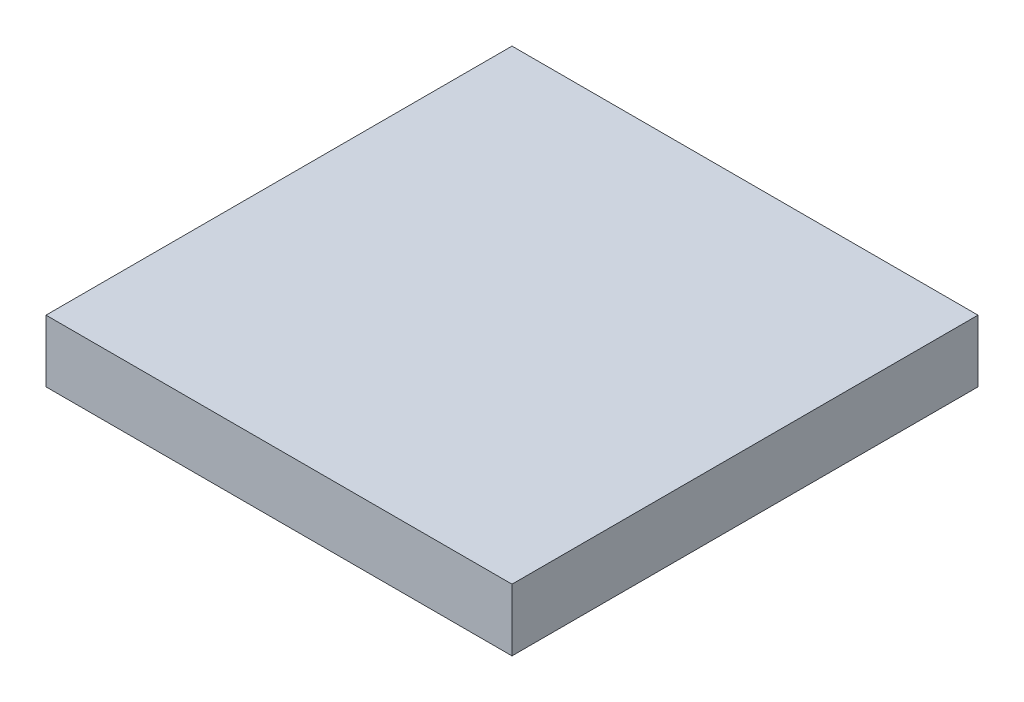
ISO-10303-21;
HEADER;
FILE_DESCRIPTION(('STEP AP214'),'2;1');
FILE_NAME('part.step','',(''),(''),'','','');
FILE_SCHEMA(('AUTOMOTIVE_DESIGN { 1 0 10303 214 1 1 1 1 }'));
ENDSEC;
DATA;
#1=APPLICATION_CONTEXT('core data for automotive mechanical design processes');
#2=APPLICATION_PROTOCOL_DEFINITION('international standard','automotive_design',2000,#1);
#3=PRODUCT_CONTEXT('',#1,'mechanical');
#4=PRODUCT('Part','Part','',(#3));
#5=PRODUCT_RELATED_PRODUCT_CATEGORY('part','',(#4));
#6=PRODUCT_DEFINITION_FORMATION('','',#4);
#7=PRODUCT_DEFINITION_CONTEXT('part definition',#1,'design');
#8=PRODUCT_DEFINITION('design','',#6,#7);
#9=PRODUCT_DEFINITION_SHAPE('','',#8);
#10=(LENGTH_UNIT() NAMED_UNIT(*) SI_UNIT(.MILLI.,.METRE.));
#11=(NAMED_UNIT(*) PLANE_ANGLE_UNIT() SI_UNIT($,.RADIAN.));
#12=(NAMED_UNIT(*) SI_UNIT($,.STERADIAN.) SOLID_ANGLE_UNIT());
#13=UNCERTAINTY_MEASURE_WITH_UNIT(LENGTH_MEASURE(1.E-05),#10,'distance_accuracy_value','');
#14=(GEOMETRIC_REPRESENTATION_CONTEXT(3) GLOBAL_UNCERTAINTY_ASSIGNED_CONTEXT((#13)) GLOBAL_UNIT_ASSIGNED_CONTEXT((#10,
#11,#12)) REPRESENTATION_CONTEXT('',''));
#15=CARTESIAN_POINT('',(0.,0.,0.));
#16=DIRECTION('',(0.,0.,1.));
#17=DIRECTION('',(1.,0.,0.));
#18=AXIS2_PLACEMENT_3D('',#15,#16,#17);
#19=CARTESIAN_POINT('',(-375.,100.,375.));
#20=DIRECTION('',(1.,0.,0.));
#21=DIRECTION('',(0.,0.,-1.));
#22=AXIS2_PLACEMENT_3D('',#19,#20,#21);
#23=PLANE('',#22);
#24=DIRECTION('',(0.,0.,1.));
#25=VECTOR('',#24,1.);
#26=CARTESIAN_POINT('',(-375.,0.,375.));
#27=LINE('',#26,#25);
#28=CARTESIAN_POINT('',(-375.,0.,-375.));
#29=VERTEX_POINT('',#28);
#30=CARTESIAN_POINT('',(-375.,0.,375.));
#31=VERTEX_POINT('',#30);
#32=EDGE_CURVE('E143',#29,#31,#27,.T.);
#33=ORIENTED_EDGE('',*,*,#32,.T.);
#34=DIRECTION('',(0.,-1.,0.));
#35=VECTOR('',#34,1.);
#36=CARTESIAN_POINT('',(-375.,100.,375.));
#37=LINE('',#36,#35);
#38=CARTESIAN_POINT('',(-375.,100.,375.));
#39=VERTEX_POINT('',#38);
#40=EDGE_CURVE('E11',#39,#31,#37,.T.);
#41=ORIENTED_EDGE('',*,*,#40,.F.);
#42=DIRECTION('',(0.,0.,1.));
#43=VECTOR('',#42,1.);
#44=CARTESIAN_POINT('',(-375.,100.,375.));
#45=LINE('',#44,#43);
#46=CARTESIAN_POINT('',(-375.,100.,-375.));
#47=VERTEX_POINT('',#46);
#48=EDGE_CURVE('E147',#47,#39,#45,.T.);
#49=ORIENTED_EDGE('',*,*,#48,.F.);
#50=DIRECTION('',(0.,-1.,0.));
#51=VECTOR('',#50,1.);
#52=CARTESIAN_POINT('',(-375.,100.,-375.));
#53=LINE('',#52,#51);
#54=EDGE_CURVE('E153',#47,#29,#53,.T.);
#55=ORIENTED_EDGE('',*,*,#54,.T.);
#56=EDGE_LOOP('',(#33,#41,#49,#55));
#57=FACE_BOUND('',#56,.T.);
#58=ADVANCED_FACE('F35',(#57),#23,.F.);
#59=CARTESIAN_POINT('',(375.,100.,375.));
#60=DIRECTION('',(0.,0.,-1.));
#61=DIRECTION('',(-1.,0.,0.));
#62=AXIS2_PLACEMENT_3D('',#59,#60,#61);
#63=PLANE('',#62);
#64=DIRECTION('',(1.,0.,0.));
#65=VECTOR('',#64,1.);
#66=CARTESIAN_POINT('',(375.,0.,375.));
#67=LINE('',#66,#65);
#68=CARTESIAN_POINT('',(375.,0.,375.));
#69=VERTEX_POINT('',#68);
#70=EDGE_CURVE('E156',#31,#69,#67,.T.);
#71=ORIENTED_EDGE('',*,*,#70,.T.);
#72=DIRECTION('',(0.,-1.,0.));
#73=VECTOR('',#72,1.);
#74=CARTESIAN_POINT('',(375.,100.,375.));
#75=LINE('',#74,#73);
#76=CARTESIAN_POINT('',(375.,100.,375.));
#77=VERTEX_POINT('',#76);
#78=EDGE_CURVE('E42',#77,#69,#75,.T.);
#79=ORIENTED_EDGE('',*,*,#78,.F.);
#80=DIRECTION('',(1.,0.,0.));
#81=VECTOR('',#80,1.);
#82=CARTESIAN_POINT('',(375.,100.,375.));
#83=LINE('',#82,#81);
#84=EDGE_CURVE('E86',#39,#77,#83,.T.);
#85=ORIENTED_EDGE('',*,*,#84,.F.);
#86=ORIENTED_EDGE('',*,*,#40,.T.);
#87=EDGE_LOOP('',(#71,#79,#85,#86));
#88=FACE_BOUND('',#87,.T.);
#89=ADVANCED_FACE('F184',(#88),#63,.F.);
#90=CARTESIAN_POINT('',(375.,100.,375.));
#91=DIRECTION('',(-1.,0.,0.));
#92=DIRECTION('',(0.,0.,1.));
#93=AXIS2_PLACEMENT_3D('',#90,#91,#92);
#94=PLANE('',#93);
#95=DIRECTION('',(0.,0.,-1.));
#96=VECTOR('',#95,1.);
#97=CARTESIAN_POINT('',(375.,0.,375.));
#98=LINE('',#97,#96);
#99=CARTESIAN_POINT('',(375.,0.,-375.));
#100=VERTEX_POINT('',#99);
#101=EDGE_CURVE('E158',#69,#100,#98,.T.);
#102=ORIENTED_EDGE('',*,*,#101,.T.);
#103=DIRECTION('',(0.,-1.,0.));
#104=VECTOR('',#103,1.);
#105=CARTESIAN_POINT('',(375.,100.,-375.));
#106=LINE('',#105,#104);
#107=CARTESIAN_POINT('',(375.,100.,-375.));
#108=VERTEX_POINT('',#107);
#109=EDGE_CURVE('E162',#108,#100,#106,.T.);
#110=ORIENTED_EDGE('',*,*,#109,.F.);
#111=DIRECTION('',(0.,0.,-1.));
#112=VECTOR('',#111,1.);
#113=CARTESIAN_POINT('',(375.,100.,375.));
#114=LINE('',#113,#112);
#115=EDGE_CURVE('E150',#77,#108,#114,.T.);
#116=ORIENTED_EDGE('',*,*,#115,.F.);
#117=ORIENTED_EDGE('',*,*,#78,.T.);
#118=EDGE_LOOP('',(#102,#110,#116,#117));
#119=FACE_BOUND('',#118,.T.);
#120=ADVANCED_FACE('F167',(#119),#94,.F.);
#121=CARTESIAN_POINT('',(375.,100.,-375.));
#122=DIRECTION('',(0.,0.,1.));
#123=DIRECTION('',(1.,0.,0.));
#124=AXIS2_PLACEMENT_3D('',#121,#122,#123);
#125=PLANE('',#124);
#126=DIRECTION('',(-1.,0.,0.));
#127=VECTOR('',#126,1.);
#128=CARTESIAN_POINT('',(375.,0.,-375.));
#129=LINE('',#128,#127);
#130=EDGE_CURVE('E79',#100,#29,#129,.T.);
#131=ORIENTED_EDGE('',*,*,#130,.T.);
#132=ORIENTED_EDGE('',*,*,#54,.F.);
#133=DIRECTION('',(-1.,0.,0.));
#134=VECTOR('',#133,1.);
#135=CARTESIAN_POINT('',(375.,100.,-375.));
#136=LINE('',#135,#134);
#137=EDGE_CURVE('E58',#108,#47,#136,.T.);
#138=ORIENTED_EDGE('',*,*,#137,.F.);
#139=ORIENTED_EDGE('',*,*,#109,.T.);
#140=EDGE_LOOP('',(#131,#132,#138,#139));
#141=FACE_BOUND('',#140,.T.);
#142=ADVANCED_FACE('F175',(#141),#125,.F.);
#143=CARTESIAN_POINT('',(0.,100.,0.));
#144=DIRECTION('',(0.,1.,0.));
#145=DIRECTION('',(0.,0.,1.));
#146=AXIS2_PLACEMENT_3D('',#143,#144,#145);
#147=PLANE('',#146);
#148=ORIENTED_EDGE('',*,*,#48,.T.);
#149=ORIENTED_EDGE('',*,*,#84,.T.);
#150=ORIENTED_EDGE('',*,*,#115,.T.);
#151=ORIENTED_EDGE('',*,*,#137,.T.);
#152=EDGE_LOOP('',(#148,#149,#150,#151));
#153=FACE_BOUND('',#152,.T.);
#154=ADVANCED_FACE('F177',(#153),#147,.T.);
#155=CARTESIAN_POINT('',(0.,0.,0.));
#156=DIRECTION('',(0.,1.,0.));
#157=DIRECTION('',(0.,0.,1.));
#158=AXIS2_PLACEMENT_3D('',#155,#156,#157);
#159=PLANE('',#158);
#160=DIRECTION('',(1.,0.,0.));
#161=VECTOR('',#160,1.);
#162=CARTESIAN_POINT('',(300.,0.,-300.));
#163=LINE('',#162,#161);
#164=CARTESIAN_POINT('',(-300.,0.,-300.));
#165=VERTEX_POINT('',#164);
#166=CARTESIAN_POINT('',(300.,0.,-300.));
#167=VERTEX_POINT('',#166);
#168=EDGE_CURVE('E137',#165,#167,#163,.T.);
#169=ORIENTED_EDGE('',*,*,#168,.F.);
#170=DIRECTION('',(0.,0.,-1.));
#171=VECTOR('',#170,1.);
#172=CARTESIAN_POINT('',(-300.,0.,-300.));
#173=LINE('',#172,#171);
#174=CARTESIAN_POINT('',(-300.,0.,300.));
#175=VERTEX_POINT('',#174);
#176=EDGE_CURVE('E49',#175,#165,#173,.T.);
#177=ORIENTED_EDGE('',*,*,#176,.F.);
#178=DIRECTION('',(-1.,0.,0.));
#179=VECTOR('',#178,1.);
#180=CARTESIAN_POINT('',(300.,0.,300.));
#181=LINE('',#180,#179);
#182=CARTESIAN_POINT('',(300.,0.,300.));
#183=VERTEX_POINT('',#182);
#184=EDGE_CURVE('E128',#183,#175,#181,.T.);
#185=ORIENTED_EDGE('',*,*,#184,.F.);
#186=DIRECTION('',(0.,0.,1.));
#187=VECTOR('',#186,1.);
#188=CARTESIAN_POINT('',(300.,0.,-300.));
#189=LINE('',#188,#187);
#190=EDGE_CURVE('E131',#167,#183,#189,.T.);
#191=ORIENTED_EDGE('',*,*,#190,.F.);
#192=EDGE_LOOP('',(#169,#177,#185,#191));
#193=FACE_BOUND('',#192,.T.);
#194=ORIENTED_EDGE('',*,*,#32,.F.);
#195=ORIENTED_EDGE('',*,*,#130,.F.);
#196=ORIENTED_EDGE('',*,*,#101,.F.);
#197=ORIENTED_EDGE('',*,*,#70,.F.);
#198=EDGE_LOOP('',(#194,#195,#196,#197));
#199=FACE_BOUND('',#198,.T.);
#200=ADVANCED_FACE('F171',(#193,#199),#159,.F.);
#201=CARTESIAN_POINT('',(-300.,50.,-300.));
#202=DIRECTION('',(-1.,0.,0.));
#203=DIRECTION('',(0.,0.,1.));
#204=AXIS2_PLACEMENT_3D('',#201,#202,#203);
#205=PLANE('',#204);
#206=ORIENTED_EDGE('',*,*,#176,.T.);
#207=DIRECTION('',(0.,-1.,0.));
#208=VECTOR('',#207,1.);
#209=CARTESIAN_POINT('',(-300.,50.,-300.));
#210=LINE('',#209,#208);
#211=CARTESIAN_POINT('',(-300.,50.,-300.));
#212=VERTEX_POINT('',#211);
#213=EDGE_CURVE('E106',#212,#165,#210,.T.);
#214=ORIENTED_EDGE('',*,*,#213,.F.);
#215=DIRECTION('',(0.,0.,-1.));
#216=VECTOR('',#215,1.);
#217=CARTESIAN_POINT('',(-300.,50.,-300.));
#218=LINE('',#217,#216);
#219=CARTESIAN_POINT('',(-300.,50.,300.));
#220=VERTEX_POINT('',#219);
#221=EDGE_CURVE('E110',#220,#212,#218,.T.);
#222=ORIENTED_EDGE('',*,*,#221,.F.);
#223=DIRECTION('',(0.,-1.,0.));
#224=VECTOR('',#223,1.);
#225=CARTESIAN_POINT('',(-300.,50.,300.));
#226=LINE('',#225,#224);
#227=EDGE_CURVE('E141',#220,#175,#226,.T.);
#228=ORIENTED_EDGE('',*,*,#227,.T.);
#229=EDGE_LOOP('',(#206,#214,#222,#228));
#230=FACE_BOUND('',#229,.T.);
#231=ADVANCED_FACE('F108',(#230),#205,.F.);
#232=CARTESIAN_POINT('',(300.,50.,300.));
#233=DIRECTION('',(0.,0.,1.));
#234=DIRECTION('',(1.,0.,0.));
#235=AXIS2_PLACEMENT_3D('',#232,#233,#234);
#236=PLANE('',#235);
#237=ORIENTED_EDGE('',*,*,#184,.T.);
#238=ORIENTED_EDGE('',*,*,#227,.F.);
#239=DIRECTION('',(-1.,0.,0.));
#240=VECTOR('',#239,1.);
#241=CARTESIAN_POINT('',(300.,50.,300.));
#242=LINE('',#241,#240);
#243=CARTESIAN_POINT('',(300.,50.,300.));
#244=VERTEX_POINT('',#243);
#245=EDGE_CURVE('E116',#244,#220,#242,.T.);
#246=ORIENTED_EDGE('',*,*,#245,.F.);
#247=DIRECTION('',(0.,-1.,0.));
#248=VECTOR('',#247,1.);
#249=CARTESIAN_POINT('',(300.,50.,300.));
#250=LINE('',#249,#248);
#251=EDGE_CURVE('E144',#244,#183,#250,.T.);
#252=ORIENTED_EDGE('',*,*,#251,.T.);
#253=EDGE_LOOP('',(#237,#238,#246,#252));
#254=FACE_BOUND('',#253,.T.);
#255=ADVANCED_FACE('F225',(#254),#236,.F.);
#256=CARTESIAN_POINT('',(300.,50.,-300.));
#257=DIRECTION('',(1.,0.,0.));
#258=DIRECTION('',(0.,0.,-1.));
#259=AXIS2_PLACEMENT_3D('',#256,#257,#258);
#260=PLANE('',#259);
#261=ORIENTED_EDGE('',*,*,#190,.T.);
#262=ORIENTED_EDGE('',*,*,#251,.F.);
#263=DIRECTION('',(0.,0.,1.));
#264=VECTOR('',#263,1.);
#265=CARTESIAN_POINT('',(300.,50.,-300.));
#266=LINE('',#265,#264);
#267=CARTESIAN_POINT('',(300.,50.,-300.));
#268=VERTEX_POINT('',#267);
#269=EDGE_CURVE('E124',#268,#244,#266,.T.);
#270=ORIENTED_EDGE('',*,*,#269,.F.);
#271=DIRECTION('',(0.,-1.,0.));
#272=VECTOR('',#271,1.);
#273=CARTESIAN_POINT('',(300.,50.,-300.));
#274=LINE('',#273,#272);
#275=EDGE_CURVE('E115',#268,#167,#274,.T.);
#276=ORIENTED_EDGE('',*,*,#275,.T.);
#277=EDGE_LOOP('',(#261,#262,#270,#276));
#278=FACE_BOUND('',#277,.T.);
#279=ADVANCED_FACE('F234',(#278),#260,.F.);
#280=CARTESIAN_POINT('',(300.,50.,-300.));
#281=DIRECTION('',(0.,0.,-1.));
#282=DIRECTION('',(-1.,0.,0.));
#283=AXIS2_PLACEMENT_3D('',#280,#281,#282);
#284=PLANE('',#283);
#285=ORIENTED_EDGE('',*,*,#168,.T.);
#286=ORIENTED_EDGE('',*,*,#275,.F.);
#287=DIRECTION('',(1.,0.,0.));
#288=VECTOR('',#287,1.);
#289=CARTESIAN_POINT('',(300.,50.,-300.));
#290=LINE('',#289,#288);
#291=EDGE_CURVE('E119',#212,#268,#290,.T.);
#292=ORIENTED_EDGE('',*,*,#291,.F.);
#293=ORIENTED_EDGE('',*,*,#213,.T.);
#294=EDGE_LOOP('',(#285,#286,#292,#293));
#295=FACE_BOUND('',#294,.T.);
#296=ADVANCED_FACE('F120',(#295),#284,.F.);
#297=CARTESIAN_POINT('',(0.,50.,0.));
#298=DIRECTION('',(0.,-1.,0.));
#299=DIRECTION('',(0.,0.,-1.));
#300=AXIS2_PLACEMENT_3D('',#297,#298,#299);
#301=PLANE('',#300);
#302=ORIENTED_EDGE('',*,*,#221,.T.);
#303=ORIENTED_EDGE('',*,*,#291,.T.);
#304=ORIENTED_EDGE('',*,*,#269,.T.);
#305=ORIENTED_EDGE('',*,*,#245,.T.);
#306=EDGE_LOOP('',(#302,#303,#304,#305));
#307=FACE_BOUND('',#306,.T.);
#308=ADVANCED_FACE('F126',(#307),#301,.T.);
#309=CLOSED_SHELL('',(#58,#89,#120,#142,#154,#200,#231,#255,#279,#296,#308));
#310=MANIFOLD_SOLID_BREP('B2',#309);
#311=ADVANCED_BREP_SHAPE_REPRESENTATION('',(#18,#310),#14);
#312=SHAPE_DEFINITION_REPRESENTATION(#9,#311);
ENDSEC;
END-ISO-10303-21;
